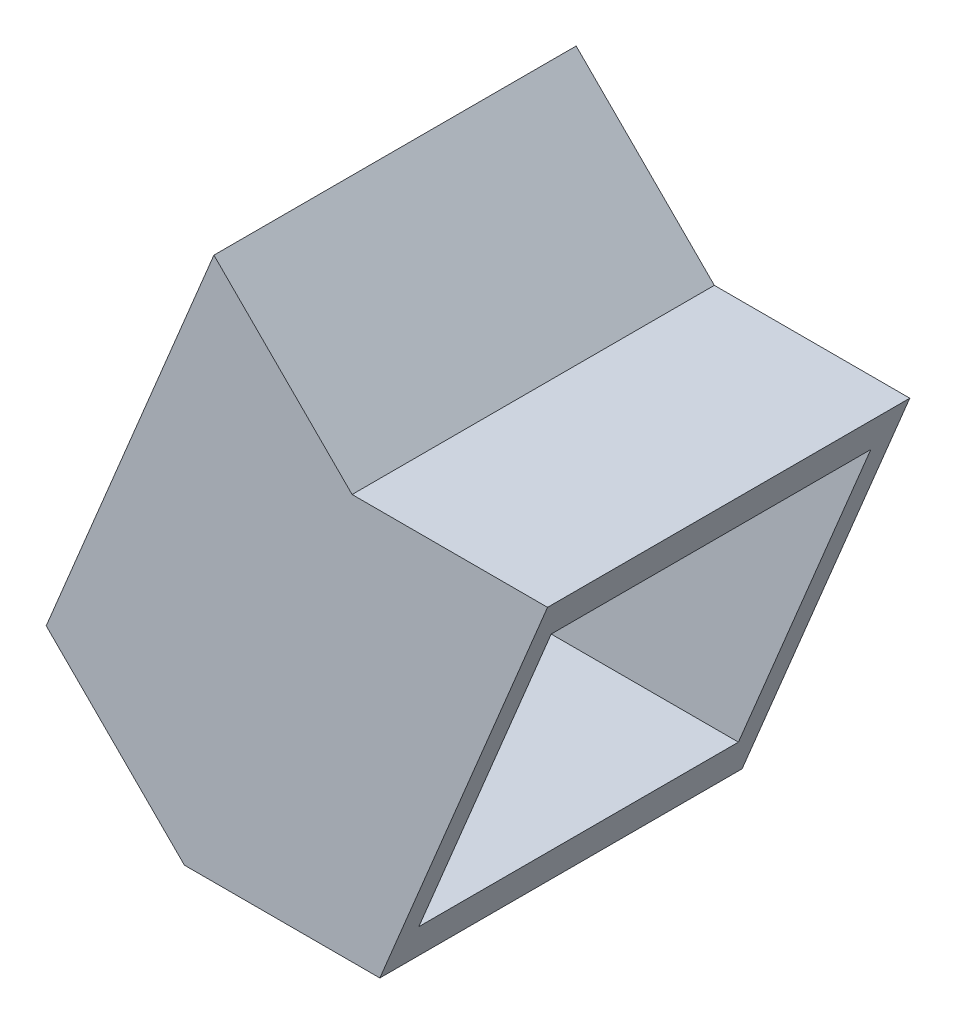
ISO-10303-21;
HEADER;
FILE_DESCRIPTION(('STEP AP214'),'2;1');
FILE_NAME('part.step','',(''),(''),'','','');
FILE_SCHEMA(('AUTOMOTIVE_DESIGN { 1 0 10303 214 1 1 1 1 }'));
ENDSEC;
DATA;
#1=APPLICATION_CONTEXT('core data for automotive mechanical design processes');
#2=APPLICATION_PROTOCOL_DEFINITION('international standard','automotive_design',2000,#1);
#3=PRODUCT_CONTEXT('',#1,'mechanical');
#4=PRODUCT('Part','Part','',(#3));
#5=PRODUCT_RELATED_PRODUCT_CATEGORY('part','',(#4));
#6=PRODUCT_DEFINITION_FORMATION('','',#4);
#7=PRODUCT_DEFINITION_CONTEXT('part definition',#1,'design');
#8=PRODUCT_DEFINITION('design','',#6,#7);
#9=PRODUCT_DEFINITION_SHAPE('','',#8);
#10=(LENGTH_UNIT() NAMED_UNIT(*) SI_UNIT(.MILLI.,.METRE.));
#11=(NAMED_UNIT(*) PLANE_ANGLE_UNIT() SI_UNIT($,.RADIAN.));
#12=(NAMED_UNIT(*) SI_UNIT($,.STERADIAN.) SOLID_ANGLE_UNIT());
#13=UNCERTAINTY_MEASURE_WITH_UNIT(LENGTH_MEASURE(1.E-05),#10,'distance_accuracy_value','');
#14=(GEOMETRIC_REPRESENTATION_CONTEXT(3) GLOBAL_UNCERTAINTY_ASSIGNED_CONTEXT((#13)) GLOBAL_UNIT_ASSIGNED_CONTEXT((#10,
#11,#12)) REPRESENTATION_CONTEXT('',''));
#15=CARTESIAN_POINT('',(0.,0.,0.));
#16=DIRECTION('',(0.,0.,1.));
#17=DIRECTION('',(1.,0.,0.));
#18=AXIS2_PLACEMENT_3D('',#15,#16,#17);
#19=CARTESIAN_POINT('',(0.,0.,32.));
#20=DIRECTION('',(0.,0.,-1.));
#21=DIRECTION('',(-1.,0.,0.));
#22=AXIS2_PLACEMENT_3D('',#19,#20,#21);
#23=PLANE('',#22);
#24=DIRECTION('',(-1.,0.,0.));
#25=VECTOR('',#24,1.);
#26=CARTESIAN_POINT('',(0.,-150.,32.));
#27=LINE('',#26,#25);
#28=CARTESIAN_POINT('',(-43.7888886054563,-150.,32.));
#29=VERTEX_POINT('',#28);
#30=CARTESIAN_POINT('',(-62.1320343559643,-150.,32.));
#31=VERTEX_POINT('',#30);
#32=EDGE_CURVE('E307',#29,#31,#27,.T.);
#33=ORIENTED_EDGE('',*,*,#32,.F.);
#34=DIRECTION('',(-0.382683432365089,-0.923879532511287,0.));
#35=VECTOR('',#34,1.);
#36=CARTESIAN_POINT('',(15.6568542494925,-6.48528137423862,32.));
#37=LINE('',#36,#35);
#38=CARTESIAN_POINT('',(-56.2152954766491,-180.,32.));
#39=VERTEX_POINT('',#38);
#40=EDGE_CURVE('E320',#29,#39,#37,.T.);
#41=ORIENTED_EDGE('',*,*,#40,.T.);
#42=DIRECTION('',(-1.,0.,0.));
#43=VECTOR('',#42,1.);
#44=CARTESIAN_POINT('',(0.,-180.,32.));
#45=LINE('',#44,#43);
#46=CARTESIAN_POINT('',(-74.5584412271572,-180.,32.));
#47=VERTEX_POINT('',#46);
#48=EDGE_CURVE('E249',#39,#47,#45,.T.);
#49=ORIENTED_EDGE('',*,*,#48,.T.);
#50=DIRECTION('',(-0.707106781186548,0.707106781186548,0.));
#51=VECTOR('',#50,1.);
#52=CARTESIAN_POINT('',(-127.279220613579,-127.279220613579,32.));
#53=LINE('',#52,#51);
#54=CARTESIAN_POINT('',(-87.5290039756343,-167.029437251523,32.));
#55=VERTEX_POINT('',#54);
#56=EDGE_CURVE('E302',#47,#55,#53,.T.);
#57=ORIENTED_EDGE('',*,*,#56,.T.);
#58=DIRECTION('',(-0.382683432365089,-0.923879532511287,0.));
#59=VECTOR('',#58,1.);
#60=CARTESIAN_POINT('',(-15.6568542494925,6.4852813742386,32.));
#61=LINE('',#60,#59);
#62=CARTESIAN_POINT('',(-75.1025971044414,-137.029437251523,32.));
#63=VERTEX_POINT('',#62);
#64=EDGE_CURVE('E312',#63,#55,#61,.T.);
#65=ORIENTED_EDGE('',*,*,#64,.F.);
#66=DIRECTION('',(-0.707106781186548,0.707106781186548,0.));
#67=VECTOR('',#66,1.);
#68=CARTESIAN_POINT('',(-106.066017177982,-106.066017177982,32.));
#69=LINE('',#68,#67);
#70=EDGE_CURVE('E305',#31,#63,#69,.T.);
#71=ORIENTED_EDGE('',*,*,#70,.F.);
#72=EDGE_LOOP('',(#33,#41,#49,#57,#65,#71));
#73=FACE_BOUND('',#72,.T.);
#74=ADVANCED_FACE('F132',(#73),#23,.T.);
#75=CARTESIAN_POINT('',(0.,-150.,34.));
#76=DIRECTION('',(0.,1.,0.));
#77=DIRECTION('',(-1.,0.,0.));
#78=AXIS2_PLACEMENT_3D('',#75,#76,#77);
#79=PLANE('',#78);
#80=DIRECTION('',(0.,0.,-1.));
#81=VECTOR('',#80,1.);
#82=CARTESIAN_POINT('',(-43.7888886054563,-150.,34.));
#83=LINE('',#82,#81);
#84=CARTESIAN_POINT('',(-43.7888886054563,-150.,2.));
#85=VERTEX_POINT('',#84);
#86=EDGE_CURVE('E322',#29,#85,#83,.T.);
#87=ORIENTED_EDGE('',*,*,#86,.F.);
#88=ORIENTED_EDGE('',*,*,#32,.T.);
#89=DIRECTION('',(0.,0.,-1.));
#90=VECTOR('',#89,1.);
#91=CARTESIAN_POINT('',(-62.1320343559643,-150.,34.));
#92=LINE('',#91,#90);
#93=CARTESIAN_POINT('',(-62.1320343559643,-150.,2.));
#94=VERTEX_POINT('',#93);
#95=EDGE_CURVE('E276',#31,#94,#92,.T.);
#96=ORIENTED_EDGE('',*,*,#95,.T.);
#97=DIRECTION('',(1.,0.,0.));
#98=VECTOR('',#97,1.);
#99=CARTESIAN_POINT('',(0.,-150.,2.));
#100=LINE('',#99,#98);
#101=EDGE_CURVE('E254',#94,#85,#100,.T.);
#102=ORIENTED_EDGE('',*,*,#101,.T.);
#103=EDGE_LOOP('',(#87,#88,#96,#102));
#104=FACE_BOUND('',#103,.T.);
#105=ADVANCED_FACE('F355',(#104),#79,.F.);
#106=CARTESIAN_POINT('',(0.,0.,2.));
#107=DIRECTION('',(0.,0.,1.));
#108=DIRECTION('',(1.,0.,0.));
#109=AXIS2_PLACEMENT_3D('',#106,#107,#108);
#110=PLANE('',#109);
#111=DIRECTION('',(1.,0.,0.));
#112=VECTOR('',#111,1.);
#113=CARTESIAN_POINT('',(0.,-180.,2.));
#114=LINE('',#113,#112);
#115=CARTESIAN_POINT('',(-74.5584412271572,-180.,2.));
#116=VERTEX_POINT('',#115);
#117=CARTESIAN_POINT('',(-56.2152954766491,-180.,2.));
#118=VERTEX_POINT('',#117);
#119=EDGE_CURVE('E263',#116,#118,#114,.T.);
#120=ORIENTED_EDGE('',*,*,#119,.T.);
#121=DIRECTION('',(0.382683432365089,0.923879532511287,0.));
#122=VECTOR('',#121,1.);
#123=CARTESIAN_POINT('',(15.6568542494925,-6.48528137423862,2.));
#124=LINE('',#123,#122);
#125=EDGE_CURVE('E292',#118,#85,#124,.T.);
#126=ORIENTED_EDGE('',*,*,#125,.T.);
#127=ORIENTED_EDGE('',*,*,#101,.F.);
#128=DIRECTION('',(0.707106781186548,-0.707106781186548,0.));
#129=VECTOR('',#128,1.);
#130=CARTESIAN_POINT('',(-106.066017177982,-106.066017177982,2.));
#131=LINE('',#130,#129);
#132=CARTESIAN_POINT('',(-75.1025971044414,-137.029437251523,2.));
#133=VERTEX_POINT('',#132);
#134=EDGE_CURVE('E259',#133,#94,#131,.T.);
#135=ORIENTED_EDGE('',*,*,#134,.F.);
#136=DIRECTION('',(0.382683432365089,0.923879532511287,0.));
#137=VECTOR('',#136,1.);
#138=CARTESIAN_POINT('',(-15.6568542494925,6.4852813742386,2.));
#139=LINE('',#138,#137);
#140=CARTESIAN_POINT('',(-87.5290039756343,-167.029437251523,2.));
#141=VERTEX_POINT('',#140);
#142=EDGE_CURVE('E296',#141,#133,#139,.T.);
#143=ORIENTED_EDGE('',*,*,#142,.F.);
#144=DIRECTION('',(0.707106781186548,-0.707106781186548,0.));
#145=VECTOR('',#144,1.);
#146=CARTESIAN_POINT('',(-127.279220613579,-127.279220613579,2.));
#147=LINE('',#146,#145);
#148=EDGE_CURVE('E261',#141,#116,#147,.T.);
#149=ORIENTED_EDGE('',*,*,#148,.T.);
#150=EDGE_LOOP('',(#120,#126,#127,#135,#143,#149));
#151=FACE_BOUND('',#150,.T.);
#152=ADVANCED_FACE('F290',(#151),#110,.T.);
#153=CARTESIAN_POINT('',(0.,-180.,34.));
#154=DIRECTION('',(0.,1.,0.));
#155=DIRECTION('',(-1.,0.,0.));
#156=AXIS2_PLACEMENT_3D('',#153,#154,#155);
#157=PLANE('',#156);
#158=ORIENTED_EDGE('',*,*,#48,.F.);
#159=DIRECTION('',(0.,0.,-1.));
#160=VECTOR('',#159,1.);
#161=CARTESIAN_POINT('',(-56.2152954766491,-180.,34.));
#162=LINE('',#161,#160);
#163=EDGE_CURVE('E140',#39,#118,#162,.T.);
#164=ORIENTED_EDGE('',*,*,#163,.T.);
#165=ORIENTED_EDGE('',*,*,#119,.F.);
#166=DIRECTION('',(0.,0.,-1.));
#167=VECTOR('',#166,1.);
#168=CARTESIAN_POINT('',(-74.5584412271572,-180.,34.));
#169=LINE('',#168,#167);
#170=EDGE_CURVE('E243',#47,#116,#169,.T.);
#171=ORIENTED_EDGE('',*,*,#170,.F.);
#172=EDGE_LOOP('',(#158,#164,#165,#171));
#173=FACE_BOUND('',#172,.T.);
#174=ADVANCED_FACE('F284',(#173),#157,.T.);
#175=CARTESIAN_POINT('',(-106.066017177982,-106.066017177982,34.));
#176=DIRECTION('',(0.707106781186547,0.707106781186547,0.));
#177=DIRECTION('',(-0.707106781186548,0.707106781186548,0.));
#178=AXIS2_PLACEMENT_3D('',#175,#176,#177);
#179=PLANE('',#178);
#180=ORIENTED_EDGE('',*,*,#70,.T.);
#181=DIRECTION('',(0.,0.,-1.));
#182=VECTOR('',#181,1.);
#183=CARTESIAN_POINT('',(-75.1025971044414,-137.029437251523,34.));
#184=LINE('',#183,#182);
#185=EDGE_CURVE('E314',#63,#133,#184,.T.);
#186=ORIENTED_EDGE('',*,*,#185,.T.);
#187=ORIENTED_EDGE('',*,*,#134,.T.);
#188=ORIENTED_EDGE('',*,*,#95,.F.);
#189=EDGE_LOOP('',(#180,#186,#187,#188));
#190=FACE_BOUND('',#189,.T.);
#191=ADVANCED_FACE('F352',(#190),#179,.F.);
#192=CARTESIAN_POINT('',(-127.279220613579,-127.279220613579,34.));
#193=DIRECTION('',(0.707106781186547,0.707106781186547,0.));
#194=DIRECTION('',(-0.707106781186548,0.707106781186548,0.));
#195=AXIS2_PLACEMENT_3D('',#192,#193,#194);
#196=PLANE('',#195);
#197=DIRECTION('',(0.,0.,-1.));
#198=VECTOR('',#197,1.);
#199=CARTESIAN_POINT('',(-87.5290039756343,-167.029437251523,34.));
#200=LINE('',#199,#198);
#201=EDGE_CURVE('E12',#55,#141,#200,.T.);
#202=ORIENTED_EDGE('',*,*,#201,.F.);
#203=ORIENTED_EDGE('',*,*,#56,.F.);
#204=ORIENTED_EDGE('',*,*,#170,.T.);
#205=ORIENTED_EDGE('',*,*,#148,.F.);
#206=EDGE_LOOP('',(#202,#203,#204,#205));
#207=FACE_BOUND('',#206,.T.);
#208=ADVANCED_FACE('F300',(#207),#196,.T.);
#209=CARTESIAN_POINT('',(15.6568542494925,-6.48528137423862,-8.));
#210=DIRECTION('',(0.923879532511287,-0.382683432365089,0.));
#211=DIRECTION('',(0.382683432365089,0.923879532511287,0.));
#212=AXIS2_PLACEMENT_3D('',#209,#210,#211);
#213=PLANE('',#212);
#214=ORIENTED_EDGE('',*,*,#86,.T.);
#215=ORIENTED_EDGE('',*,*,#125,.F.);
#216=ORIENTED_EDGE('',*,*,#163,.F.);
#217=ORIENTED_EDGE('',*,*,#40,.F.);
#218=EDGE_LOOP('',(#214,#215,#216,#217));
#219=FACE_BOUND('',#218,.T.);
#220=DIRECTION('',(0.382683432365089,0.923879532511287,0.));
#221=VECTOR('',#220,1.);
#222=CARTESIAN_POINT('',(15.6568542494925,-6.48528137423862,0.));
#223=LINE('',#222,#221);
#224=CARTESIAN_POINT('',(-57.8721497261415,-184.,0.));
#225=VERTEX_POINT('',#224);
#226=CARTESIAN_POINT('',(-42.1320343559639,-146.,0.));
#227=VERTEX_POINT('',#226);
#228=EDGE_CURVE('E318',#225,#227,#223,.T.);
#229=ORIENTED_EDGE('',*,*,#228,.T.);
#230=DIRECTION('',(0.,0.,1.));
#231=VECTOR('',#230,1.);
#232=CARTESIAN_POINT('',(-42.1320343559639,-146.,-8.));
#233=LINE('',#232,#231);
#234=CARTESIAN_POINT('',(-42.1320343559639,-146.,34.));
#235=VERTEX_POINT('',#234);
#236=EDGE_CURVE('E327',#227,#235,#233,.T.);
#237=ORIENTED_EDGE('',*,*,#236,.T.);
#238=DIRECTION('',(0.382683432365089,0.923879532511287,0.));
#239=VECTOR('',#238,1.);
#240=CARTESIAN_POINT('',(15.6568542494925,-6.48528137423862,34.));
#241=LINE('',#240,#239);
#242=CARTESIAN_POINT('',(-57.8721497261415,-184.,34.));
#243=VERTEX_POINT('',#242);
#244=EDGE_CURVE('E155',#243,#235,#241,.T.);
#245=ORIENTED_EDGE('',*,*,#244,.F.);
#246=DIRECTION('',(0.,0.,1.));
#247=VECTOR('',#246,1.);
#248=CARTESIAN_POINT('',(-57.8721497261415,-184.,-8.));
#249=LINE('',#248,#247);
#250=EDGE_CURVE('E324',#225,#243,#249,.T.);
#251=ORIENTED_EDGE('',*,*,#250,.F.);
#252=EDGE_LOOP('',(#229,#237,#245,#251));
#253=FACE_BOUND('',#252,.T.);
#254=ADVANCED_FACE('F343',(#219,#253),#213,.T.);
#255=CARTESIAN_POINT('',(-15.6568542494925,6.4852813742386,-8.));
#256=DIRECTION('',(0.923879532511287,-0.382683432365089,0.));
#257=DIRECTION('',(0.382683432365089,0.923879532511287,0.));
#258=AXIS2_PLACEMENT_3D('',#255,#256,#257);
#259=PLANE('',#258);
#260=ORIENTED_EDGE('',*,*,#64,.T.);
#261=ORIENTED_EDGE('',*,*,#201,.T.);
#262=ORIENTED_EDGE('',*,*,#142,.T.);
#263=ORIENTED_EDGE('',*,*,#185,.F.);
#264=EDGE_LOOP('',(#260,#261,#262,#263));
#265=FACE_BOUND('',#264,.T.);
#266=DIRECTION('',(0.,0.,1.));
#267=VECTOR('',#266,1.);
#268=CARTESIAN_POINT('',(-89.1858582251267,-171.029437251523,-8.));
#269=LINE('',#268,#267);
#270=CARTESIAN_POINT('',(-89.1858582251267,-171.029437251523,0.));
#271=VERTEX_POINT('',#270);
#272=CARTESIAN_POINT('',(-89.1858582251267,-171.029437251523,34.));
#273=VERTEX_POINT('',#272);
#274=EDGE_CURVE('E217',#271,#273,#269,.T.);
#275=ORIENTED_EDGE('',*,*,#274,.T.);
#276=DIRECTION('',(0.382683432365089,0.923879532511287,0.));
#277=VECTOR('',#276,1.);
#278=CARTESIAN_POINT('',(-15.6568542494925,6.4852813742386,34.));
#279=LINE('',#278,#277);
#280=CARTESIAN_POINT('',(-73.445742854949,-133.029437251523,34.));
#281=VERTEX_POINT('',#280);
#282=EDGE_CURVE('E220',#273,#281,#279,.T.);
#283=ORIENTED_EDGE('',*,*,#282,.T.);
#284=DIRECTION('',(0.,0.,1.));
#285=VECTOR('',#284,1.);
#286=CARTESIAN_POINT('',(-73.445742854949,-133.029437251523,-8.));
#287=LINE('',#286,#285);
#288=CARTESIAN_POINT('',(-73.445742854949,-133.029437251523,0.));
#289=VERTEX_POINT('',#288);
#290=EDGE_CURVE('E225',#289,#281,#287,.T.);
#291=ORIENTED_EDGE('',*,*,#290,.F.);
#292=DIRECTION('',(0.382683432365089,0.923879532511287,0.));
#293=VECTOR('',#292,1.);
#294=CARTESIAN_POINT('',(-15.6568542494925,6.4852813742386,0.));
#295=LINE('',#294,#293);
#296=EDGE_CURVE('E147',#271,#289,#295,.T.);
#297=ORIENTED_EDGE('',*,*,#296,.F.);
#298=EDGE_LOOP('',(#275,#283,#291,#297));
#299=FACE_BOUND('',#298,.T.);
#300=ADVANCED_FACE('F219',(#265,#299),#259,.F.);
#301=CARTESIAN_POINT('',(0.,-146.,34.));
#302=DIRECTION('',(0.,1.,0.));
#303=DIRECTION('',(-1.,0.,0.));
#304=AXIS2_PLACEMENT_3D('',#301,#302,#303);
#305=PLANE('',#304);
#306=DIRECTION('',(1.,0.,0.));
#307=VECTOR('',#306,1.);
#308=CARTESIAN_POINT('',(0.,-146.,34.));
#309=LINE('',#308,#307);
#310=CARTESIAN_POINT('',(-60.475180106472,-146.,34.));
#311=VERTEX_POINT('',#310);
#312=EDGE_CURVE('E267',#311,#235,#309,.T.);
#313=ORIENTED_EDGE('',*,*,#312,.T.);
#314=ORIENTED_EDGE('',*,*,#236,.F.);
#315=DIRECTION('',(1.,0.,0.));
#316=VECTOR('',#315,1.);
#317=CARTESIAN_POINT('',(0.,-146.,0.));
#318=LINE('',#317,#316);
#319=CARTESIAN_POINT('',(-60.475180106472,-146.,0.));
#320=VERTEX_POINT('',#319);
#321=EDGE_CURVE('E266',#320,#227,#318,.T.);
#322=ORIENTED_EDGE('',*,*,#321,.F.);
#323=DIRECTION('',(0.,0.,-1.));
#324=VECTOR('',#323,1.);
#325=CARTESIAN_POINT('',(-60.475180106472,-146.,34.));
#326=LINE('',#325,#324);
#327=EDGE_CURVE('E272',#311,#320,#326,.T.);
#328=ORIENTED_EDGE('',*,*,#327,.F.);
#329=EDGE_LOOP('',(#313,#314,#322,#328));
#330=FACE_BOUND('',#329,.T.);
#331=ADVANCED_FACE('F134',(#330),#305,.T.);
#332=CARTESIAN_POINT('',(0.,0.,34.));
#333=DIRECTION('',(0.,0.,1.));
#334=DIRECTION('',(1.,0.,0.));
#335=AXIS2_PLACEMENT_3D('',#332,#333,#334);
#336=PLANE('',#335);
#337=DIRECTION('',(1.,0.,0.));
#338=VECTOR('',#337,1.);
#339=CARTESIAN_POINT('',(0.,-184.,34.));
#340=LINE('',#339,#338);
#341=CARTESIAN_POINT('',(-76.2152954766495,-184.,34.));
#342=VERTEX_POINT('',#341);
#343=EDGE_CURVE('E240',#342,#243,#340,.T.);
#344=ORIENTED_EDGE('',*,*,#343,.T.);
#345=ORIENTED_EDGE('',*,*,#244,.T.);
#346=ORIENTED_EDGE('',*,*,#312,.F.);
#347=DIRECTION('',(0.707106781186548,-0.707106781186548,0.));
#348=VECTOR('',#347,1.);
#349=CARTESIAN_POINT('',(-103.237590053236,-103.237590053236,34.));
#350=LINE('',#349,#348);
#351=EDGE_CURVE('E234',#281,#311,#350,.T.);
#352=ORIENTED_EDGE('',*,*,#351,.F.);
#353=ORIENTED_EDGE('',*,*,#282,.F.);
#354=DIRECTION('',(0.707106781186548,-0.707106781186548,0.));
#355=VECTOR('',#354,1.);
#356=CARTESIAN_POINT('',(-130.107647738325,-130.107647738325,34.));
#357=LINE('',#356,#355);
#358=EDGE_CURVE('E231',#273,#342,#357,.T.);
#359=ORIENTED_EDGE('',*,*,#358,.T.);
#360=EDGE_LOOP('',(#344,#345,#346,#352,#353,#359));
#361=FACE_BOUND('',#360,.T.);
#362=ADVANCED_FACE('F230',(#361),#336,.T.);
#363=CARTESIAN_POINT('',(0.,0.,0.));
#364=DIRECTION('',(0.,0.,1.));
#365=DIRECTION('',(1.,0.,0.));
#366=AXIS2_PLACEMENT_3D('',#363,#364,#365);
#367=PLANE('',#366);
#368=ORIENTED_EDGE('',*,*,#228,.F.);
#369=DIRECTION('',(1.,0.,0.));
#370=VECTOR('',#369,1.);
#371=CARTESIAN_POINT('',(0.,-184.,0.));
#372=LINE('',#371,#370);
#373=CARTESIAN_POINT('',(-76.2152954766495,-184.,0.));
#374=VERTEX_POINT('',#373);
#375=EDGE_CURVE('E241',#374,#225,#372,.T.);
#376=ORIENTED_EDGE('',*,*,#375,.F.);
#377=DIRECTION('',(0.707106781186548,-0.707106781186548,0.));
#378=VECTOR('',#377,1.);
#379=CARTESIAN_POINT('',(-130.107647738325,-130.107647738325,0.));
#380=LINE('',#379,#378);
#381=EDGE_CURVE('E246',#271,#374,#380,.T.);
#382=ORIENTED_EDGE('',*,*,#381,.F.);
#383=ORIENTED_EDGE('',*,*,#296,.T.);
#384=DIRECTION('',(0.707106781186548,-0.707106781186548,0.));
#385=VECTOR('',#384,1.);
#386=CARTESIAN_POINT('',(-103.237590053236,-103.237590053236,0.));
#387=LINE('',#386,#385);
#388=EDGE_CURVE('E270',#289,#320,#387,.T.);
#389=ORIENTED_EDGE('',*,*,#388,.T.);
#390=ORIENTED_EDGE('',*,*,#321,.T.);
#391=EDGE_LOOP('',(#368,#376,#382,#383,#389,#390));
#392=FACE_BOUND('',#391,.T.);
#393=ADVANCED_FACE('F339',(#392),#367,.F.);
#394=CARTESIAN_POINT('',(0.,-184.,34.));
#395=DIRECTION('',(0.,1.,0.));
#396=DIRECTION('',(-1.,0.,0.));
#397=AXIS2_PLACEMENT_3D('',#394,#395,#396);
#398=PLANE('',#397);
#399=ORIENTED_EDGE('',*,*,#250,.T.);
#400=ORIENTED_EDGE('',*,*,#343,.F.);
#401=DIRECTION('',(0.,0.,-1.));
#402=VECTOR('',#401,1.);
#403=CARTESIAN_POINT('',(-76.2152954766495,-184.,34.));
#404=LINE('',#403,#402);
#405=EDGE_CURVE('E238',#342,#374,#404,.T.);
#406=ORIENTED_EDGE('',*,*,#405,.T.);
#407=ORIENTED_EDGE('',*,*,#375,.T.);
#408=EDGE_LOOP('',(#399,#400,#406,#407));
#409=FACE_BOUND('',#408,.T.);
#410=ADVANCED_FACE('F342',(#409),#398,.F.);
#411=CARTESIAN_POINT('',(-103.237590053236,-103.237590053236,34.));
#412=DIRECTION('',(0.707106781186547,0.707106781186547,0.));
#413=DIRECTION('',(-0.707106781186548,0.707106781186548,0.));
#414=AXIS2_PLACEMENT_3D('',#411,#412,#413);
#415=PLANE('',#414);
#416=ORIENTED_EDGE('',*,*,#290,.T.);
#417=ORIENTED_EDGE('',*,*,#351,.T.);
#418=ORIENTED_EDGE('',*,*,#327,.T.);
#419=ORIENTED_EDGE('',*,*,#388,.F.);
#420=EDGE_LOOP('',(#416,#417,#418,#419));
#421=FACE_BOUND('',#420,.T.);
#422=ADVANCED_FACE('F336',(#421),#415,.T.);
#423=CARTESIAN_POINT('',(-130.107647738325,-130.107647738325,34.));
#424=DIRECTION('',(0.707106781186547,0.707106781186547,0.));
#425=DIRECTION('',(-0.707106781186548,0.707106781186548,0.));
#426=AXIS2_PLACEMENT_3D('',#423,#424,#425);
#427=PLANE('',#426);
#428=ORIENTED_EDGE('',*,*,#358,.F.);
#429=ORIENTED_EDGE('',*,*,#274,.F.);
#430=ORIENTED_EDGE('',*,*,#381,.T.);
#431=ORIENTED_EDGE('',*,*,#405,.F.);
#432=EDGE_LOOP('',(#428,#429,#430,#431));
#433=FACE_BOUND('',#432,.T.);
#434=ADVANCED_FACE('F236',(#433),#427,.F.);
#435=CLOSED_SHELL('',(#74,#105,#152,#174,#191,#208,#254,#300,#331,#362,#393,#410,#422,#434));
#436=MANIFOLD_SOLID_BREP('B2',#435);
#437=ADVANCED_BREP_SHAPE_REPRESENTATION('',(#18,#436),#14);
#438=SHAPE_DEFINITION_REPRESENTATION(#9,#437);
ENDSEC;
END-ISO-10303-21;
